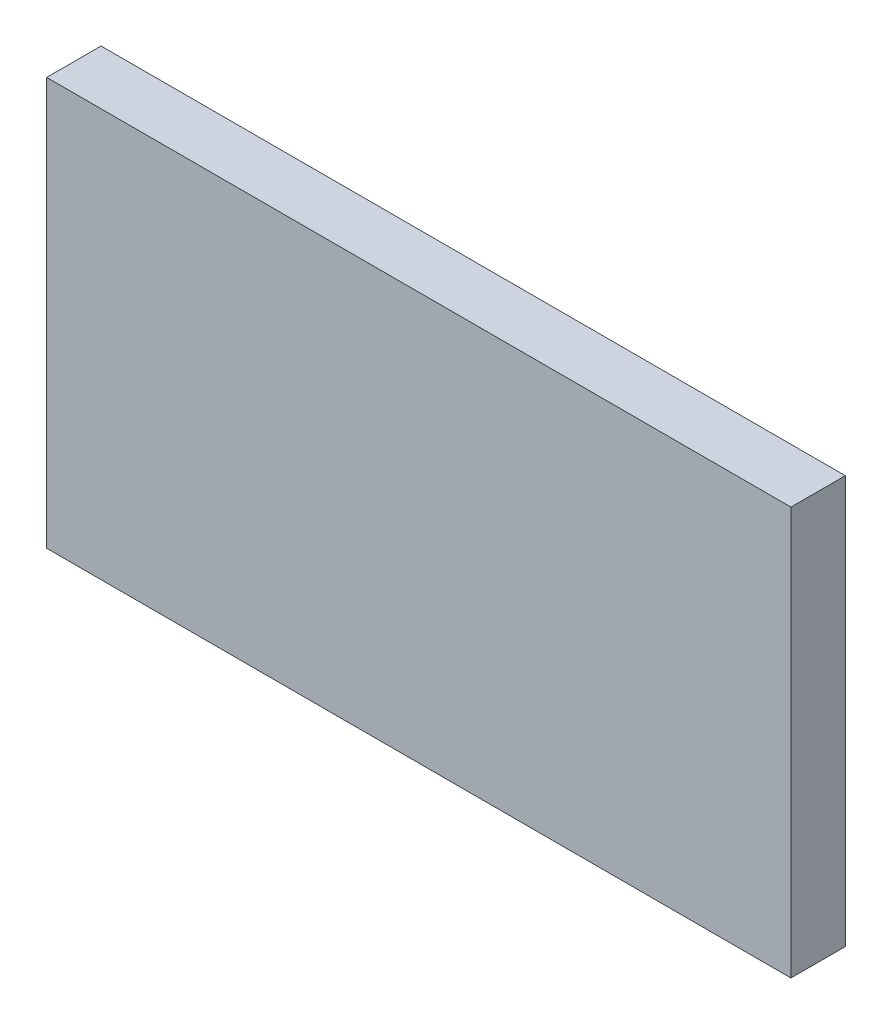
ISO-10303-21;
HEADER;
FILE_DESCRIPTION(('STEP AP214'),'2;1');
FILE_NAME('part.step','',(''),(''),'','','');
FILE_SCHEMA(('AUTOMOTIVE_DESIGN { 1 0 10303 214 1 1 1 1 }'));
ENDSEC;
DATA;
#1=APPLICATION_CONTEXT('core data for automotive mechanical design processes');
#2=APPLICATION_PROTOCOL_DEFINITION('international standard','automotive_design',2000,#1);
#3=PRODUCT_CONTEXT('',#1,'mechanical');
#4=PRODUCT('Part','Part','',(#3));
#5=PRODUCT_RELATED_PRODUCT_CATEGORY('part','',(#4));
#6=PRODUCT_DEFINITION_FORMATION('','',#4);
#7=PRODUCT_DEFINITION_CONTEXT('part definition',#1,'design');
#8=PRODUCT_DEFINITION('design','',#6,#7);
#9=PRODUCT_DEFINITION_SHAPE('','',#8);
#10=(LENGTH_UNIT() NAMED_UNIT(*) SI_UNIT(.MILLI.,.METRE.));
#11=(NAMED_UNIT(*) PLANE_ANGLE_UNIT() SI_UNIT($,.RADIAN.));
#12=(NAMED_UNIT(*) SI_UNIT($,.STERADIAN.) SOLID_ANGLE_UNIT());
#13=UNCERTAINTY_MEASURE_WITH_UNIT(LENGTH_MEASURE(1.E-05),#10,'distance_accuracy_value','');
#14=(GEOMETRIC_REPRESENTATION_CONTEXT(3) GLOBAL_UNCERTAINTY_ASSIGNED_CONTEXT((#13)) GLOBAL_UNIT_ASSIGNED_CONTEXT((#10,
#11,#12)) REPRESENTATION_CONTEXT('',''));
#15=CARTESIAN_POINT('',(0.,0.,0.));
#16=DIRECTION('',(0.,0.,1.));
#17=DIRECTION('',(1.,0.,0.));
#18=AXIS2_PLACEMENT_3D('',#15,#16,#17);
#19=CARTESIAN_POINT('',(-20.0525,15.5175,-2.317));
#20=DIRECTION('',(-1.,0.,0.));
#21=DIRECTION('',(0.,0.,1.));
#22=AXIS2_PLACEMENT_3D('',#19,#20,#21);
#23=PLANE('',#22);
#24=DIRECTION('',(0.,-1.,0.));
#25=VECTOR('',#24,1.);
#26=CARTESIAN_POINT('',(-20.0525,15.5175,0.));
#27=LINE('',#26,#25);
#28=CARTESIAN_POINT('',(-20.0525,15.5175,0.));
#29=VERTEX_POINT('',#28);
#30=CARTESIAN_POINT('',(-20.0525,-1.8635,0.));
#31=VERTEX_POINT('',#30);
#32=EDGE_CURVE('E103',#29,#31,#27,.T.);
#33=ORIENTED_EDGE('',*,*,#32,.F.);
#34=DIRECTION('',(0.,0.,1.));
#35=VECTOR('',#34,1.);
#36=CARTESIAN_POINT('',(-20.0525,15.5175,-2.317));
#37=LINE('',#36,#35);
#38=CARTESIAN_POINT('',(-20.0525,15.5175,-2.317));
#39=VERTEX_POINT('',#38);
#40=EDGE_CURVE('E11',#39,#29,#37,.T.);
#41=ORIENTED_EDGE('',*,*,#40,.F.);
#42=DIRECTION('',(0.,-1.,0.));
#43=VECTOR('',#42,1.);
#44=CARTESIAN_POINT('',(-20.0525,15.5175,-2.317));
#45=LINE('',#44,#43);
#46=CARTESIAN_POINT('',(-20.0525,-1.8635,-2.317));
#47=VERTEX_POINT('',#46);
#48=EDGE_CURVE('E98',#39,#47,#45,.T.);
#49=ORIENTED_EDGE('',*,*,#48,.T.);
#50=DIRECTION('',(0.,0.,1.));
#51=VECTOR('',#50,1.);
#52=CARTESIAN_POINT('',(-20.0525,-1.8635,-2.317));
#53=LINE('',#52,#51);
#54=EDGE_CURVE('E42',#47,#31,#53,.T.);
#55=ORIENTED_EDGE('',*,*,#54,.T.);
#56=EDGE_LOOP('',(#33,#41,#49,#55));
#57=FACE_BOUND('',#56,.T.);
#58=ADVANCED_FACE('F41',(#57),#23,.T.);
#59=CARTESIAN_POINT('',(11.6665,15.5175,-2.317));
#60=DIRECTION('',(0.,1.,0.));
#61=DIRECTION('',(0.,0.,1.));
#62=AXIS2_PLACEMENT_3D('',#59,#60,#61);
#63=PLANE('',#62);
#64=DIRECTION('',(-1.,0.,0.));
#65=VECTOR('',#64,1.);
#66=CARTESIAN_POINT('',(11.6665,15.5175,0.));
#67=LINE('',#66,#65);
#68=CARTESIAN_POINT('',(11.6665,15.5175,0.));
#69=VERTEX_POINT('',#68);
#70=EDGE_CURVE('E102',#69,#29,#67,.T.);
#71=ORIENTED_EDGE('',*,*,#70,.F.);
#72=DIRECTION('',(0.,0.,1.));
#73=VECTOR('',#72,1.);
#74=CARTESIAN_POINT('',(11.6665,15.5175,-2.317));
#75=LINE('',#74,#73);
#76=CARTESIAN_POINT('',(11.6665,15.5175,-2.317));
#77=VERTEX_POINT('',#76);
#78=EDGE_CURVE('E49',#77,#69,#75,.T.);
#79=ORIENTED_EDGE('',*,*,#78,.F.);
#80=DIRECTION('',(-1.,0.,0.));
#81=VECTOR('',#80,1.);
#82=CARTESIAN_POINT('',(11.6665,15.5175,-2.317));
#83=LINE('',#82,#81);
#84=EDGE_CURVE('E96',#77,#39,#83,.T.);
#85=ORIENTED_EDGE('',*,*,#84,.T.);
#86=ORIENTED_EDGE('',*,*,#40,.T.);
#87=EDGE_LOOP('',(#71,#79,#85,#86));
#88=FACE_BOUND('',#87,.T.);
#89=ADVANCED_FACE('F113',(#88),#63,.T.);
#90=CARTESIAN_POINT('',(11.6665,-1.8635,-2.317));
#91=DIRECTION('',(1.,0.,0.));
#92=DIRECTION('',(0.,0.,-1.));
#93=AXIS2_PLACEMENT_3D('',#90,#91,#92);
#94=PLANE('',#93);
#95=DIRECTION('',(0.,1.,0.));
#96=VECTOR('',#95,1.);
#97=CARTESIAN_POINT('',(11.6665,-1.8635,0.));
#98=LINE('',#97,#96);
#99=CARTESIAN_POINT('',(11.6665,-1.8635,0.));
#100=VERTEX_POINT('',#99);
#101=EDGE_CURVE('E91',#100,#69,#98,.T.);
#102=ORIENTED_EDGE('',*,*,#101,.F.);
#103=DIRECTION('',(0.,0.,1.));
#104=VECTOR('',#103,1.);
#105=CARTESIAN_POINT('',(11.6665,-1.8635,-2.317));
#106=LINE('',#105,#104);
#107=CARTESIAN_POINT('',(11.6665,-1.8635,-2.317));
#108=VERTEX_POINT('',#107);
#109=EDGE_CURVE('E86',#108,#100,#106,.T.);
#110=ORIENTED_EDGE('',*,*,#109,.F.);
#111=DIRECTION('',(0.,1.,0.));
#112=VECTOR('',#111,1.);
#113=CARTESIAN_POINT('',(11.6665,-1.8635,-2.317));
#114=LINE('',#113,#112);
#115=EDGE_CURVE('E87',#108,#77,#114,.T.);
#116=ORIENTED_EDGE('',*,*,#115,.T.);
#117=ORIENTED_EDGE('',*,*,#78,.T.);
#118=EDGE_LOOP('',(#102,#110,#116,#117));
#119=FACE_BOUND('',#118,.T.);
#120=ADVANCED_FACE('F88',(#119),#94,.T.);
#121=CARTESIAN_POINT('',(-20.0525,-1.8635,-2.317));
#122=DIRECTION('',(0.,-1.,0.));
#123=DIRECTION('',(0.,0.,-1.));
#124=AXIS2_PLACEMENT_3D('',#121,#122,#123);
#125=PLANE('',#124);
#126=DIRECTION('',(1.,0.,0.));
#127=VECTOR('',#126,1.);
#128=CARTESIAN_POINT('',(-20.0525,-1.8635,0.));
#129=LINE('',#128,#127);
#130=EDGE_CURVE('E110',#31,#100,#129,.T.);
#131=ORIENTED_EDGE('',*,*,#130,.F.);
#132=ORIENTED_EDGE('',*,*,#54,.F.);
#133=DIRECTION('',(1.,0.,0.));
#134=VECTOR('',#133,1.);
#135=CARTESIAN_POINT('',(-20.0525,-1.8635,-2.317));
#136=LINE('',#135,#134);
#137=EDGE_CURVE('E94',#47,#108,#136,.T.);
#138=ORIENTED_EDGE('',*,*,#137,.T.);
#139=ORIENTED_EDGE('',*,*,#109,.T.);
#140=EDGE_LOOP('',(#131,#132,#138,#139));
#141=FACE_BOUND('',#140,.T.);
#142=ADVANCED_FACE('F97',(#141),#125,.T.);
#143=CARTESIAN_POINT('',(0.,0.,-2.317));
#144=DIRECTION('',(0.,0.,1.));
#145=DIRECTION('',(1.,0.,0.));
#146=AXIS2_PLACEMENT_3D('',#143,#144,#145);
#147=PLANE('',#146);
#148=ORIENTED_EDGE('',*,*,#48,.F.);
#149=ORIENTED_EDGE('',*,*,#84,.F.);
#150=ORIENTED_EDGE('',*,*,#115,.F.);
#151=ORIENTED_EDGE('',*,*,#137,.F.);
#152=EDGE_LOOP('',(#148,#149,#150,#151));
#153=FACE_BOUND('',#152,.T.);
#154=ADVANCED_FACE('F92',(#153),#147,.F.);
#155=CARTESIAN_POINT('',(0.,0.,0.));
#156=DIRECTION('',(0.,0.,1.));
#157=DIRECTION('',(1.,0.,0.));
#158=AXIS2_PLACEMENT_3D('',#155,#156,#157);
#159=PLANE('',#158);
#160=ORIENTED_EDGE('',*,*,#32,.T.);
#161=ORIENTED_EDGE('',*,*,#130,.T.);
#162=ORIENTED_EDGE('',*,*,#101,.T.);
#163=ORIENTED_EDGE('',*,*,#70,.T.);
#164=EDGE_LOOP('',(#160,#161,#162,#163));
#165=FACE_BOUND('',#164,.T.);
#166=ADVANCED_FACE('F114',(#165),#159,.T.);
#167=CLOSED_SHELL('',(#58,#89,#120,#142,#154,#166));
#168=MANIFOLD_SOLID_BREP('B2',#167);
#169=ADVANCED_BREP_SHAPE_REPRESENTATION('',(#18,#168),#14);
#170=SHAPE_DEFINITION_REPRESENTATION(#9,#169);
ENDSEC;
END-ISO-10303-21;
